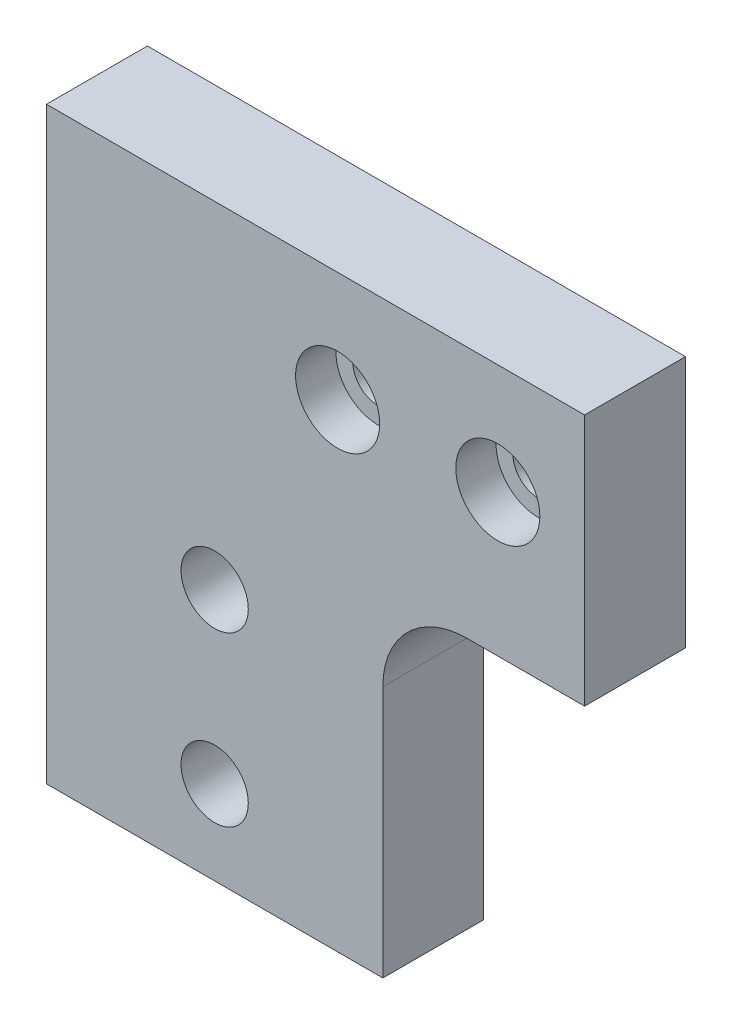
ISO-10303-21;
HEADER;
FILE_DESCRIPTION(('STEP AP214'),'2;1');
FILE_NAME('part.step','',(''),(''),'','','');
FILE_SCHEMA(('AUTOMOTIVE_DESIGN { 1 0 10303 214 1 1 1 1 }'));
ENDSEC;
DATA;
#1=APPLICATION_CONTEXT('core data for automotive mechanical design processes');
#2=APPLICATION_PROTOCOL_DEFINITION('international standard','automotive_design',2000,#1);
#3=PRODUCT_CONTEXT('',#1,'mechanical');
#4=PRODUCT('Part','Part','',(#3));
#5=PRODUCT_RELATED_PRODUCT_CATEGORY('part','',(#4));
#6=PRODUCT_DEFINITION_FORMATION('','',#4);
#7=PRODUCT_DEFINITION_CONTEXT('part definition',#1,'design');
#8=PRODUCT_DEFINITION('design','',#6,#7);
#9=PRODUCT_DEFINITION_SHAPE('','',#8);
#10=(LENGTH_UNIT() NAMED_UNIT(*) SI_UNIT(.MILLI.,.METRE.));
#11=(NAMED_UNIT(*) PLANE_ANGLE_UNIT() SI_UNIT($,.RADIAN.));
#12=(NAMED_UNIT(*) SI_UNIT($,.STERADIAN.) SOLID_ANGLE_UNIT());
#13=UNCERTAINTY_MEASURE_WITH_UNIT(LENGTH_MEASURE(1.E-05),#10,'distance_accuracy_value','');
#14=(GEOMETRIC_REPRESENTATION_CONTEXT(3) GLOBAL_UNCERTAINTY_ASSIGNED_CONTEXT((#13)) GLOBAL_UNIT_ASSIGNED_CONTEXT((#10,
#11,#12)) REPRESENTATION_CONTEXT('',''));
#15=CARTESIAN_POINT('',(0.,0.,0.));
#16=DIRECTION('',(0.,0.,1.));
#17=DIRECTION('',(1.,0.,0.));
#18=AXIS2_PLACEMENT_3D('',#15,#16,#17);
#19=CARTESIAN_POINT('',(1.3125,10.9375,10.2426406871193));
#20=DIRECTION('',(0.,0.,-1.));
#21=DIRECTION('',(-1.,0.,0.));
#22=AXIS2_PLACEMENT_3D('',#19,#20,#21);
#23=CYLINDRICAL_SURFACE('',#22,1.5);
#24=CARTESIAN_POINT('',(1.3125,10.9375,0.));
#25=DIRECTION('',(0.,0.,-1.));
#26=DIRECTION('',(-1.,0.,0.));
#27=AXIS2_PLACEMENT_3D('',#24,#25,#26);
#28=CIRCLE('',#27,1.5);
#29=CARTESIAN_POINT('',(-0.1875,10.9375,0.));
#30=VERTEX_POINT('',#29);
#31=EDGE_CURVE('E149',#30,#30,#28,.T.);
#32=ORIENTED_EDGE('',*,*,#31,.T.);
#33=EDGE_LOOP('',(#32));
#34=FACE_BOUND('',#33,.T.);
#35=CARTESIAN_POINT('',(1.3125,10.9375,3.6));
#36=DIRECTION('',(0.,0.,1.));
#37=DIRECTION('',(1.,0.,0.));
#38=AXIS2_PLACEMENT_3D('',#35,#36,#37);
#39=CIRCLE('',#38,1.5);
#40=CARTESIAN_POINT('',(2.8125,10.9375,3.6));
#41=VERTEX_POINT('',#40);
#42=EDGE_CURVE('E37',#41,#41,#39,.F.);
#43=ORIENTED_EDGE('',*,*,#42,.F.);
#44=EDGE_LOOP('',(#43));
#45=FACE_BOUND('',#44,.T.);
#46=ADVANCED_FACE('F33',(#34,#45),#23,.F.);
#47=CARTESIAN_POINT('',(10.8375,10.9375,10.2426406871193));
#48=DIRECTION('',(0.,0.,-1.));
#49=DIRECTION('',(-1.,0.,0.));
#50=AXIS2_PLACEMENT_3D('',#47,#48,#49);
#51=CYLINDRICAL_SURFACE('',#50,1.5);
#52=CARTESIAN_POINT('',(10.8375,10.9375,0.));
#53=DIRECTION('',(0.,0.,-1.));
#54=DIRECTION('',(-1.,0.,0.));
#55=AXIS2_PLACEMENT_3D('',#52,#53,#54);
#56=CIRCLE('',#55,1.5);
#57=CARTESIAN_POINT('',(9.3375,10.9375,0.));
#58=VERTEX_POINT('',#57);
#59=EDGE_CURVE('E164',#58,#58,#56,.T.);
#60=ORIENTED_EDGE('',*,*,#59,.T.);
#61=EDGE_LOOP('',(#60));
#62=FACE_BOUND('',#61,.T.);
#63=CARTESIAN_POINT('',(10.8375,10.9375,3.6));
#64=DIRECTION('',(0.,0.,1.));
#65=DIRECTION('',(1.,0.,0.));
#66=AXIS2_PLACEMENT_3D('',#63,#64,#65);
#67=CIRCLE('',#66,1.5);
#68=CARTESIAN_POINT('',(12.3375,10.9375,3.6));
#69=VERTEX_POINT('',#68);
#70=EDGE_CURVE('E143',#69,#69,#67,.F.);
#71=ORIENTED_EDGE('',*,*,#70,.F.);
#72=EDGE_LOOP('',(#71));
#73=FACE_BOUND('',#72,.T.);
#74=ADVANCED_FACE('F220',(#62,#73),#51,.F.);
#75=CARTESIAN_POINT('',(16.,17.5,6.));
#76=DIRECTION('',(-1.,0.,0.));
#77=DIRECTION('',(0.,-1.,0.));
#78=AXIS2_PLACEMENT_3D('',#75,#76,#77);
#79=PLANE('',#78);
#80=DIRECTION('',(0.,1.,0.));
#81=VECTOR('',#80,1.);
#82=CARTESIAN_POINT('',(16.,17.5,6.));
#83=LINE('',#82,#81);
#84=CARTESIAN_POINT('',(16.,2.5,6.));
#85=VERTEX_POINT('',#84);
#86=CARTESIAN_POINT('',(16.,17.5,6.));
#87=VERTEX_POINT('',#86);
#88=EDGE_CURVE('E103',#85,#87,#83,.T.);
#89=ORIENTED_EDGE('',*,*,#88,.F.);
#90=DIRECTION('',(0.,0.,1.));
#91=VECTOR('',#90,1.);
#92=CARTESIAN_POINT('',(16.,2.5,-23.3238075793812));
#93=LINE('',#92,#91);
#94=CARTESIAN_POINT('',(16.,2.5,0.));
#95=VERTEX_POINT('',#94);
#96=EDGE_CURVE('E91',#95,#85,#93,.T.);
#97=ORIENTED_EDGE('',*,*,#96,.F.);
#98=DIRECTION('',(0.,1.,0.));
#99=VECTOR('',#98,1.);
#100=CARTESIAN_POINT('',(16.,17.5,0.));
#101=LINE('',#100,#99);
#102=CARTESIAN_POINT('',(16.,17.5,0.));
#103=VERTEX_POINT('',#102);
#104=EDGE_CURVE('E128',#95,#103,#101,.T.);
#105=ORIENTED_EDGE('',*,*,#104,.T.);
#106=DIRECTION('',(0.,0.,-1.));
#107=VECTOR('',#106,1.);
#108=CARTESIAN_POINT('',(16.,17.5,6.));
#109=LINE('',#108,#107);
#110=EDGE_CURVE('E110',#87,#103,#109,.T.);
#111=ORIENTED_EDGE('',*,*,#110,.F.);
#112=EDGE_LOOP('',(#89,#97,#105,#111));
#113=FACE_BOUND('',#112,.T.);
#114=ADVANCED_FACE('F108',(#113),#79,.F.);
#115=CARTESIAN_POINT('',(-16.,17.5,6.));
#116=DIRECTION('',(0.,-1.,0.));
#117=DIRECTION('',(0.,0.,-1.));
#118=AXIS2_PLACEMENT_3D('',#115,#116,#117);
#119=PLANE('',#118);
#120=DIRECTION('',(-1.,0.,0.));
#121=VECTOR('',#120,1.);
#122=CARTESIAN_POINT('',(-16.,17.5,0.));
#123=LINE('',#122,#121);
#124=CARTESIAN_POINT('',(-16.,17.5,0.));
#125=VERTEX_POINT('',#124);
#126=EDGE_CURVE('E130',#103,#125,#123,.T.);
#127=ORIENTED_EDGE('',*,*,#126,.T.);
#128=DIRECTION('',(0.,0.,-1.));
#129=VECTOR('',#128,1.);
#130=CARTESIAN_POINT('',(-16.,17.5,6.));
#131=LINE('',#130,#129);
#132=CARTESIAN_POINT('',(-16.,17.5,6.));
#133=VERTEX_POINT('',#132);
#134=EDGE_CURVE('E135',#133,#125,#131,.T.);
#135=ORIENTED_EDGE('',*,*,#134,.F.);
#136=DIRECTION('',(-1.,0.,0.));
#137=VECTOR('',#136,1.);
#138=CARTESIAN_POINT('',(-16.,17.5,6.));
#139=LINE('',#138,#137);
#140=EDGE_CURVE('E111',#87,#133,#139,.T.);
#141=ORIENTED_EDGE('',*,*,#140,.F.);
#142=ORIENTED_EDGE('',*,*,#110,.T.);
#143=EDGE_LOOP('',(#127,#135,#141,#142));
#144=FACE_BOUND('',#143,.T.);
#145=ADVANCED_FACE('F212',(#144),#119,.F.);
#146=CARTESIAN_POINT('',(-16.,17.5,6.));
#147=DIRECTION('',(1.,0.,0.));
#148=DIRECTION('',(0.,1.,0.));
#149=AXIS2_PLACEMENT_3D('',#146,#147,#148);
#150=PLANE('',#149);
#151=DIRECTION('',(0.,-1.,0.));
#152=VECTOR('',#151,1.);
#153=CARTESIAN_POINT('',(-16.,17.5,0.));
#154=LINE('',#153,#152);
#155=CARTESIAN_POINT('',(-16.,-17.5,0.));
#156=VERTEX_POINT('',#155);
#157=EDGE_CURVE('E117',#125,#156,#154,.T.);
#158=ORIENTED_EDGE('',*,*,#157,.T.);
#159=DIRECTION('',(0.,0.,-1.));
#160=VECTOR('',#159,1.);
#161=CARTESIAN_POINT('',(-16.,-17.5,6.));
#162=LINE('',#161,#160);
#163=CARTESIAN_POINT('',(-16.,-17.5,6.));
#164=VERTEX_POINT('',#163);
#165=EDGE_CURVE('E127',#164,#156,#162,.T.);
#166=ORIENTED_EDGE('',*,*,#165,.F.);
#167=DIRECTION('',(0.,-1.,0.));
#168=VECTOR('',#167,1.);
#169=CARTESIAN_POINT('',(-16.,17.5,6.));
#170=LINE('',#169,#168);
#171=EDGE_CURVE('E114',#133,#164,#170,.T.);
#172=ORIENTED_EDGE('',*,*,#171,.F.);
#173=ORIENTED_EDGE('',*,*,#134,.T.);
#174=EDGE_LOOP('',(#158,#166,#172,#173));
#175=FACE_BOUND('',#174,.T.);
#176=ADVANCED_FACE('F209',(#175),#150,.F.);
#177=CARTESIAN_POINT('',(-16.,-17.5,6.));
#178=DIRECTION('',(0.,1.,0.));
#179=DIRECTION('',(0.,0.,1.));
#180=AXIS2_PLACEMENT_3D('',#177,#178,#179);
#181=PLANE('',#180);
#182=DIRECTION('',(1.,0.,0.));
#183=VECTOR('',#182,1.);
#184=CARTESIAN_POINT('',(-16.,-17.5,0.));
#185=LINE('',#184,#183);
#186=CARTESIAN_POINT('',(4.,-17.5,0.));
#187=VERTEX_POINT('',#186);
#188=EDGE_CURVE('E112',#156,#187,#185,.T.);
#189=ORIENTED_EDGE('',*,*,#188,.T.);
#190=DIRECTION('',(0.,0.,1.));
#191=VECTOR('',#190,1.);
#192=CARTESIAN_POINT('',(4.,-17.5,-23.3238075793812));
#193=LINE('',#192,#191);
#194=CARTESIAN_POINT('',(4.,-17.5,6.));
#195=VERTEX_POINT('',#194);
#196=EDGE_CURVE('E98',#187,#195,#193,.T.);
#197=ORIENTED_EDGE('',*,*,#196,.T.);
#198=DIRECTION('',(1.,0.,0.));
#199=VECTOR('',#198,1.);
#200=CARTESIAN_POINT('',(-16.,-17.5,6.));
#201=LINE('',#200,#199);
#202=EDGE_CURVE('E124',#164,#195,#201,.T.);
#203=ORIENTED_EDGE('',*,*,#202,.F.);
#204=ORIENTED_EDGE('',*,*,#165,.T.);
#205=EDGE_LOOP('',(#189,#197,#203,#204));
#206=FACE_BOUND('',#205,.T.);
#207=ADVANCED_FACE('F205',(#206),#181,.F.);
#208=CARTESIAN_POINT('',(0.,0.,6.));
#209=DIRECTION('',(0.,0.,1.));
#210=DIRECTION('',(1.,0.,0.));
#211=AXIS2_PLACEMENT_3D('',#208,#209,#210);
#212=PLANE('',#211);
#213=CARTESIAN_POINT('',(10.8375,10.9375,6.));
#214=DIRECTION('',(0.,0.,1.));
#215=DIRECTION('',(1.,0.,0.));
#216=AXIS2_PLACEMENT_3D('',#213,#214,#215);
#217=CIRCLE('',#216,2.5);
#218=CARTESIAN_POINT('',(13.3375,10.9375,6.));
#219=VERTEX_POINT('',#218);
#220=EDGE_CURVE('E151',#219,#219,#217,.T.);
#221=ORIENTED_EDGE('',*,*,#220,.F.);
#222=EDGE_LOOP('',(#221));
#223=FACE_BOUND('',#222,.T.);
#224=CARTESIAN_POINT('',(1.3125,10.9375,6.));
#225=DIRECTION('',(0.,0.,1.));
#226=DIRECTION('',(1.,0.,0.));
#227=AXIS2_PLACEMENT_3D('',#224,#225,#226);
#228=CIRCLE('',#227,2.5);
#229=CARTESIAN_POINT('',(3.8125,10.9375,6.));
#230=VERTEX_POINT('',#229);
#231=EDGE_CURVE('E161',#230,#230,#228,.T.);
#232=ORIENTED_EDGE('',*,*,#231,.F.);
#233=EDGE_LOOP('',(#232));
#234=FACE_BOUND('',#233,.T.);
#235=DIRECTION('',(0.,-1.,0.));
#236=VECTOR('',#235,1.);
#237=CARTESIAN_POINT('',(4.,-17.5,6.));
#238=LINE('',#237,#236);
#239=CARTESIAN_POINT('',(4.,-2.5,6.));
#240=VERTEX_POINT('',#239);
#241=EDGE_CURVE('E99',#240,#195,#238,.T.);
#242=ORIENTED_EDGE('',*,*,#241,.F.);
#243=CARTESIAN_POINT('',(9.00000000000001,-2.5,6.));
#244=DIRECTION('',(0.,0.,1.));
#245=DIRECTION('',(1.,0.,0.));
#246=AXIS2_PLACEMENT_3D('',#243,#244,#245);
#247=CIRCLE('',#246,5.);
#248=CARTESIAN_POINT('',(9.00000000000001,2.5,6.));
#249=VERTEX_POINT('',#248);
#250=EDGE_CURVE('E42',#240,#249,#247,.F.);
#251=ORIENTED_EDGE('',*,*,#250,.T.);
#252=DIRECTION('',(-1.,0.,0.));
#253=VECTOR('',#252,1.);
#254=CARTESIAN_POINT('',(16.,2.5,6.));
#255=LINE('',#254,#253);
#256=EDGE_CURVE('E93',#85,#249,#255,.T.);
#257=ORIENTED_EDGE('',*,*,#256,.F.);
#258=ORIENTED_EDGE('',*,*,#88,.T.);
#259=ORIENTED_EDGE('',*,*,#140,.T.);
#260=ORIENTED_EDGE('',*,*,#171,.T.);
#261=ORIENTED_EDGE('',*,*,#202,.T.);
#262=EDGE_LOOP('',(#242,#251,#257,#258,#259,#260,#261));
#263=FACE_BOUND('',#262,.T.);
#264=CARTESIAN_POINT('',(-6.,-12.5,6.));
#265=DIRECTION('',(0.,0.,1.));
#266=DIRECTION('',(1.,0.,0.));
#267=AXIS2_PLACEMENT_3D('',#264,#265,#266);
#268=CIRCLE('',#267,2.);
#269=CARTESIAN_POINT('',(-4.,-12.5,6.));
#270=VERTEX_POINT('',#269);
#271=EDGE_CURVE('E177',#270,#270,#268,.T.);
#272=ORIENTED_EDGE('',*,*,#271,.F.);
#273=EDGE_LOOP('',(#272));
#274=FACE_BOUND('',#273,.T.);
#275=CARTESIAN_POINT('',(-6.,-2.5,6.));
#276=DIRECTION('',(0.,0.,1.));
#277=DIRECTION('',(1.,0.,0.));
#278=AXIS2_PLACEMENT_3D('',#275,#276,#277);
#279=CIRCLE('',#278,2.);
#280=CARTESIAN_POINT('',(-4.,-2.5,6.));
#281=VERTEX_POINT('',#280);
#282=EDGE_CURVE('E167',#281,#281,#279,.T.);
#283=ORIENTED_EDGE('',*,*,#282,.F.);
#284=EDGE_LOOP('',(#283));
#285=FACE_BOUND('',#284,.T.);
#286=ADVANCED_FACE('F101',(#223,#234,#263,#274,#285),#212,.T.);
#287=CARTESIAN_POINT('',(0.,0.,0.));
#288=DIRECTION('',(0.,0.,1.));
#289=DIRECTION('',(1.,0.,0.));
#290=AXIS2_PLACEMENT_3D('',#287,#288,#289);
#291=PLANE('',#290);
#292=ORIENTED_EDGE('',*,*,#59,.F.);
#293=EDGE_LOOP('',(#292));
#294=FACE_BOUND('',#293,.T.);
#295=ORIENTED_EDGE('',*,*,#31,.F.);
#296=EDGE_LOOP('',(#295));
#297=FACE_BOUND('',#296,.T.);
#298=CARTESIAN_POINT('',(-6.,-12.5,0.));
#299=DIRECTION('',(0.,0.,1.));
#300=DIRECTION('',(1.,0.,0.));
#301=AXIS2_PLACEMENT_3D('',#298,#299,#300);
#302=CIRCLE('',#301,2.);
#303=CARTESIAN_POINT('',(-4.,-12.5,0.));
#304=VERTEX_POINT('',#303);
#305=EDGE_CURVE('E105',#304,#304,#302,.F.);
#306=ORIENTED_EDGE('',*,*,#305,.F.);
#307=EDGE_LOOP('',(#306));
#308=FACE_BOUND('',#307,.T.);
#309=CARTESIAN_POINT('',(-6.,-2.5,0.));
#310=DIRECTION('',(0.,0.,1.));
#311=DIRECTION('',(1.,0.,0.));
#312=AXIS2_PLACEMENT_3D('',#309,#310,#311);
#313=CIRCLE('',#312,2.);
#314=CARTESIAN_POINT('',(-4.,-2.5,0.));
#315=VERTEX_POINT('',#314);
#316=EDGE_CURVE('E120',#315,#315,#313,.F.);
#317=ORIENTED_EDGE('',*,*,#316,.F.);
#318=EDGE_LOOP('',(#317));
#319=FACE_BOUND('',#318,.T.);
#320=DIRECTION('',(1.,0.,0.));
#321=VECTOR('',#320,1.);
#322=CARTESIAN_POINT('',(16.,2.5,0.));
#323=LINE('',#322,#321);
#324=CARTESIAN_POINT('',(9.00000000000001,2.5,0.));
#325=VERTEX_POINT('',#324);
#326=EDGE_CURVE('E94',#325,#95,#323,.T.);
#327=ORIENTED_EDGE('',*,*,#326,.F.);
#328=CARTESIAN_POINT('',(9.00000000000001,-2.5,0.));
#329=DIRECTION('',(0.,0.,1.));
#330=DIRECTION('',(1.,0.,0.));
#331=AXIS2_PLACEMENT_3D('',#328,#329,#330);
#332=CIRCLE('',#331,5.);
#333=CARTESIAN_POINT('',(4.,-2.5,0.));
#334=VERTEX_POINT('',#333);
#335=EDGE_CURVE('E11',#325,#334,#332,.T.);
#336=ORIENTED_EDGE('',*,*,#335,.T.);
#337=DIRECTION('',(0.,1.,0.));
#338=VECTOR('',#337,1.);
#339=CARTESIAN_POINT('',(4.,-17.5,0.));
#340=LINE('',#339,#338);
#341=EDGE_CURVE('E170',#187,#334,#340,.T.);
#342=ORIENTED_EDGE('',*,*,#341,.F.);
#343=ORIENTED_EDGE('',*,*,#188,.F.);
#344=ORIENTED_EDGE('',*,*,#157,.F.);
#345=ORIENTED_EDGE('',*,*,#126,.F.);
#346=ORIENTED_EDGE('',*,*,#104,.F.);
#347=EDGE_LOOP('',(#327,#336,#342,#343,#344,#345,#346));
#348=FACE_BOUND('',#347,.T.);
#349=ADVANCED_FACE('F189',(#294,#297,#308,#319,#348),#291,.F.);
#350=CARTESIAN_POINT('',(-6.,-2.5,-23.3238075793812));
#351=DIRECTION('',(0.,0.,1.));
#352=DIRECTION('',(1.,0.,0.));
#353=AXIS2_PLACEMENT_3D('',#350,#351,#352);
#354=CYLINDRICAL_SURFACE('',#353,2.);
#355=ORIENTED_EDGE('',*,*,#316,.T.);
#356=EDGE_LOOP('',(#355));
#357=FACE_BOUND('',#356,.T.);
#358=ORIENTED_EDGE('',*,*,#282,.T.);
#359=EDGE_LOOP('',(#358));
#360=FACE_BOUND('',#359,.T.);
#361=ADVANCED_FACE('F187',(#357,#360),#354,.F.);
#362=CARTESIAN_POINT('',(-6.,-12.5,-23.3238075793812));
#363=DIRECTION('',(0.,0.,1.));
#364=DIRECTION('',(1.,0.,0.));
#365=AXIS2_PLACEMENT_3D('',#362,#363,#364);
#366=CYLINDRICAL_SURFACE('',#365,2.);
#367=ORIENTED_EDGE('',*,*,#305,.T.);
#368=EDGE_LOOP('',(#367));
#369=FACE_BOUND('',#368,.T.);
#370=ORIENTED_EDGE('',*,*,#271,.T.);
#371=EDGE_LOOP('',(#370));
#372=FACE_BOUND('',#371,.T.);
#373=ADVANCED_FACE('F234',(#369,#372),#366,.F.);
#374=CARTESIAN_POINT('',(4.,-17.5,-23.3238075793812));
#375=DIRECTION('',(-1.,0.,0.));
#376=DIRECTION('',(0.,0.,1.));
#377=AXIS2_PLACEMENT_3D('',#374,#375,#376);
#378=PLANE('',#377);
#379=ORIENTED_EDGE('',*,*,#341,.T.);
#380=DIRECTION('',(0.,0.,1.));
#381=VECTOR('',#380,1.);
#382=CARTESIAN_POINT('',(4.,-2.5,6.));
#383=LINE('',#382,#381);
#384=EDGE_CURVE('E139',#334,#240,#383,.T.);
#385=ORIENTED_EDGE('',*,*,#384,.T.);
#386=ORIENTED_EDGE('',*,*,#241,.T.);
#387=ORIENTED_EDGE('',*,*,#196,.F.);
#388=EDGE_LOOP('',(#379,#385,#386,#387));
#389=FACE_BOUND('',#388,.T.);
#390=ADVANCED_FACE('F200',(#389),#378,.F.);
#391=CARTESIAN_POINT('',(16.,2.5,-23.3238075793812));
#392=DIRECTION('',(0.,1.,0.));
#393=DIRECTION('',(-1.,0.,0.));
#394=AXIS2_PLACEMENT_3D('',#391,#392,#393);
#395=PLANE('',#394);
#396=ORIENTED_EDGE('',*,*,#256,.T.);
#397=DIRECTION('',(0.,0.,1.));
#398=VECTOR('',#397,1.);
#399=CARTESIAN_POINT('',(9.00000000000001,2.5,0.));
#400=LINE('',#399,#398);
#401=EDGE_CURVE('E56',#249,#325,#400,.F.);
#402=ORIENTED_EDGE('',*,*,#401,.T.);
#403=ORIENTED_EDGE('',*,*,#326,.T.);
#404=ORIENTED_EDGE('',*,*,#96,.T.);
#405=EDGE_LOOP('',(#396,#402,#403,#404));
#406=FACE_BOUND('',#405,.T.);
#407=ADVANCED_FACE('F92',(#406),#395,.F.);
#408=CARTESIAN_POINT('',(9.00000000000001,-2.5,-23.3238075793812));
#409=DIRECTION('',(0.,0.,-1.));
#410=DIRECTION('',(-1.,0.,0.));
#411=AXIS2_PLACEMENT_3D('',#408,#409,#410);
#412=CYLINDRICAL_SURFACE('',#411,5.);
#413=ORIENTED_EDGE('',*,*,#335,.F.);
#414=ORIENTED_EDGE('',*,*,#401,.F.);
#415=ORIENTED_EDGE('',*,*,#250,.F.);
#416=ORIENTED_EDGE('',*,*,#384,.F.);
#417=EDGE_LOOP('',(#413,#414,#415,#416));
#418=FACE_BOUND('',#417,.T.);
#419=ADVANCED_FACE('F35',(#418),#412,.F.);
#420=CARTESIAN_POINT('',(10.8375,10.9375,3.6));
#421=DIRECTION('',(0.,0.,1.));
#422=DIRECTION('',(1.,0.,0.));
#423=AXIS2_PLACEMENT_3D('',#420,#421,#422);
#424=PLANE('',#423);
#425=CARTESIAN_POINT('',(10.8375,10.9375,3.6));
#426=DIRECTION('',(0.,0.,1.));
#427=DIRECTION('',(1.,0.,0.));
#428=AXIS2_PLACEMENT_3D('',#425,#426,#427);
#429=CIRCLE('',#428,2.5);
#430=CARTESIAN_POINT('',(13.3375,10.9375,3.6));
#431=VERTEX_POINT('',#430);
#432=EDGE_CURVE('E145',#431,#431,#429,.T.);
#433=ORIENTED_EDGE('',*,*,#432,.T.);
#434=EDGE_LOOP('',(#433));
#435=FACE_BOUND('',#434,.T.);
#436=ORIENTED_EDGE('',*,*,#70,.T.);
#437=EDGE_LOOP('',(#436));
#438=FACE_BOUND('',#437,.T.);
#439=ADVANCED_FACE('F286',(#435,#438),#424,.T.);
#440=CARTESIAN_POINT('',(10.8375,10.9375,3.6));
#441=DIRECTION('',(0.,0.,1.));
#442=DIRECTION('',(1.,0.,0.));
#443=AXIS2_PLACEMENT_3D('',#440,#441,#442);
#444=CYLINDRICAL_SURFACE('',#443,2.5);
#445=ORIENTED_EDGE('',*,*,#432,.F.);
#446=EDGE_LOOP('',(#445));
#447=FACE_BOUND('',#446,.T.);
#448=ORIENTED_EDGE('',*,*,#220,.T.);
#449=EDGE_LOOP('',(#448));
#450=FACE_BOUND('',#449,.T.);
#451=ADVANCED_FACE('F301',(#447,#450),#444,.F.);
#452=CARTESIAN_POINT('',(1.3125,10.9375,3.6));
#453=DIRECTION('',(0.,0.,1.));
#454=DIRECTION('',(1.,0.,0.));
#455=AXIS2_PLACEMENT_3D('',#452,#453,#454);
#456=PLANE('',#455);
#457=CARTESIAN_POINT('',(1.3125,10.9375,3.6));
#458=DIRECTION('',(0.,0.,1.));
#459=DIRECTION('',(1.,0.,0.));
#460=AXIS2_PLACEMENT_3D('',#457,#458,#459);
#461=CIRCLE('',#460,2.5);
#462=CARTESIAN_POINT('',(3.8125,10.9375,3.6));
#463=VERTEX_POINT('',#462);
#464=EDGE_CURVE('E156',#463,#463,#461,.T.);
#465=ORIENTED_EDGE('',*,*,#464,.T.);
#466=EDGE_LOOP('',(#465));
#467=FACE_BOUND('',#466,.T.);
#468=ORIENTED_EDGE('',*,*,#42,.T.);
#469=EDGE_LOOP('',(#468));
#470=FACE_BOUND('',#469,.T.);
#471=ADVANCED_FACE('F307',(#467,#470),#456,.T.);
#472=CARTESIAN_POINT('',(1.3125,10.9375,3.6));
#473=DIRECTION('',(0.,0.,1.));
#474=DIRECTION('',(1.,0.,0.));
#475=AXIS2_PLACEMENT_3D('',#472,#473,#474);
#476=CYLINDRICAL_SURFACE('',#475,2.5);
#477=ORIENTED_EDGE('',*,*,#464,.F.);
#478=EDGE_LOOP('',(#477));
#479=FACE_BOUND('',#478,.T.);
#480=ORIENTED_EDGE('',*,*,#231,.T.);
#481=EDGE_LOOP('',(#480));
#482=FACE_BOUND('',#481,.T.);
#483=ADVANCED_FACE('F315',(#479,#482),#476,.F.);
#484=CLOSED_SHELL('',(#46,#74,#114,#145,#176,#207,#286,#349,#361,#373,#390,#407,#419,#439,#451,
#471,#483));
#485=MANIFOLD_SOLID_BREP('B2',#484);
#486=ADVANCED_BREP_SHAPE_REPRESENTATION('',(#18,#485),#14);
#487=SHAPE_DEFINITION_REPRESENTATION(#9,#486);
ENDSEC;
END-ISO-10303-21;
